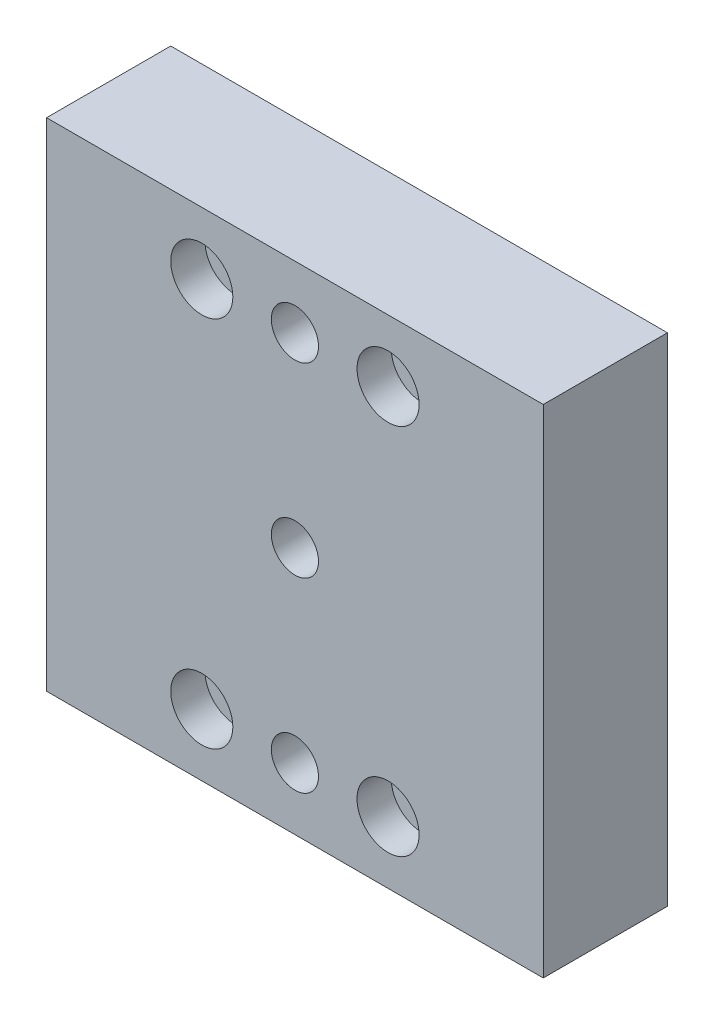
ISO-10303-21;
HEADER;
FILE_DESCRIPTION(('STEP AP214'),'2;1');
FILE_NAME('part.step','',(''),(''),'','','');
FILE_SCHEMA(('AUTOMOTIVE_DESIGN { 1 0 10303 214 1 1 1 1 }'));
ENDSEC;
DATA;
#1=APPLICATION_CONTEXT('core data for automotive mechanical design processes');
#2=APPLICATION_PROTOCOL_DEFINITION('international standard','automotive_design',2000,#1);
#3=PRODUCT_CONTEXT('',#1,'mechanical');
#4=PRODUCT('Part','Part','',(#3));
#5=PRODUCT_RELATED_PRODUCT_CATEGORY('part','',(#4));
#6=PRODUCT_DEFINITION_FORMATION('','',#4);
#7=PRODUCT_DEFINITION_CONTEXT('part definition',#1,'design');
#8=PRODUCT_DEFINITION('design','',#6,#7);
#9=PRODUCT_DEFINITION_SHAPE('','',#8);
#10=(LENGTH_UNIT() NAMED_UNIT(*) SI_UNIT(.MILLI.,.METRE.));
#11=(NAMED_UNIT(*) PLANE_ANGLE_UNIT() SI_UNIT($,.RADIAN.));
#12=(NAMED_UNIT(*) SI_UNIT($,.STERADIAN.) SOLID_ANGLE_UNIT());
#13=UNCERTAINTY_MEASURE_WITH_UNIT(LENGTH_MEASURE(1.E-05),#10,'distance_accuracy_value','');
#14=(GEOMETRIC_REPRESENTATION_CONTEXT(3) GLOBAL_UNCERTAINTY_ASSIGNED_CONTEXT((#13)) GLOBAL_UNIT_ASSIGNED_CONTEXT((#10,
#11,#12)) REPRESENTATION_CONTEXT('',''));
#15=CARTESIAN_POINT('',(0.,0.,0.));
#16=DIRECTION('',(0.,0.,1.));
#17=DIRECTION('',(1.,0.,0.));
#18=AXIS2_PLACEMENT_3D('',#15,#16,#17);
#19=CARTESIAN_POINT('',(25.4,-25.4,12.7));
#20=DIRECTION('',(-1.,0.,0.));
#21=DIRECTION('',(0.,0.,1.));
#22=AXIS2_PLACEMENT_3D('',#19,#20,#21);
#23=PLANE('',#22);
#24=DIRECTION('',(0.,1.,0.));
#25=VECTOR('',#24,1.);
#26=CARTESIAN_POINT('',(25.4,-25.4,0.));
#27=LINE('',#26,#25);
#28=CARTESIAN_POINT('',(25.4,-25.4,0.));
#29=VERTEX_POINT('',#28);
#30=CARTESIAN_POINT('',(25.4,25.4,0.));
#31=VERTEX_POINT('',#30);
#32=EDGE_CURVE('E111',#29,#31,#27,.T.);
#33=ORIENTED_EDGE('',*,*,#32,.T.);
#34=DIRECTION('',(0.,0.,-1.));
#35=VECTOR('',#34,1.);
#36=CARTESIAN_POINT('',(25.4,25.4,12.7));
#37=LINE('',#36,#35);
#38=CARTESIAN_POINT('',(25.4,25.4,12.7));
#39=VERTEX_POINT('',#38);
#40=EDGE_CURVE('E13',#39,#31,#37,.T.);
#41=ORIENTED_EDGE('',*,*,#40,.F.);
#42=DIRECTION('',(0.,1.,0.));
#43=VECTOR('',#42,1.);
#44=CARTESIAN_POINT('',(25.4,-25.4,12.7));
#45=LINE('',#44,#43);
#46=CARTESIAN_POINT('',(25.4,-25.4,12.7));
#47=VERTEX_POINT('',#46);
#48=EDGE_CURVE('E98',#47,#39,#45,.T.);
#49=ORIENTED_EDGE('',*,*,#48,.F.);
#50=DIRECTION('',(0.,0.,-1.));
#51=VECTOR('',#50,1.);
#52=CARTESIAN_POINT('',(25.4,-25.4,12.7));
#53=LINE('',#52,#51);
#54=EDGE_CURVE('E107',#47,#29,#53,.T.);
#55=ORIENTED_EDGE('',*,*,#54,.T.);
#56=EDGE_LOOP('',(#33,#41,#49,#55));
#57=FACE_BOUND('',#56,.T.);
#58=ADVANCED_FACE('F45',(#57),#23,.F.);
#59=CARTESIAN_POINT('',(-25.4,25.4,12.7));
#60=DIRECTION('',(0.,-1.,0.));
#61=DIRECTION('',(0.,0.,-1.));
#62=AXIS2_PLACEMENT_3D('',#59,#60,#61);
#63=PLANE('',#62);
#64=DIRECTION('',(-1.,0.,0.));
#65=VECTOR('',#64,1.);
#66=CARTESIAN_POINT('',(-25.4,25.4,0.));
#67=LINE('',#66,#65);
#68=CARTESIAN_POINT('',(-25.4,25.4,0.));
#69=VERTEX_POINT('',#68);
#70=EDGE_CURVE('E102',#31,#69,#67,.T.);
#71=ORIENTED_EDGE('',*,*,#70,.T.);
#72=DIRECTION('',(0.,0.,-1.));
#73=VECTOR('',#72,1.);
#74=CARTESIAN_POINT('',(-25.4,25.4,12.7));
#75=LINE('',#74,#73);
#76=CARTESIAN_POINT('',(-25.4,25.4,12.7));
#77=VERTEX_POINT('',#76);
#78=EDGE_CURVE('E54',#77,#69,#75,.T.);
#79=ORIENTED_EDGE('',*,*,#78,.F.);
#80=DIRECTION('',(-1.,0.,0.));
#81=VECTOR('',#80,1.);
#82=CARTESIAN_POINT('',(-25.4,25.4,12.7));
#83=LINE('',#82,#81);
#84=EDGE_CURVE('E93',#39,#77,#83,.T.);
#85=ORIENTED_EDGE('',*,*,#84,.F.);
#86=ORIENTED_EDGE('',*,*,#40,.T.);
#87=EDGE_LOOP('',(#71,#79,#85,#86));
#88=FACE_BOUND('',#87,.T.);
#89=ADVANCED_FACE('F101',(#88),#63,.F.);
#90=CARTESIAN_POINT('',(-25.4,-25.4,12.7));
#91=DIRECTION('',(1.,0.,0.));
#92=DIRECTION('',(0.,0.,-1.));
#93=AXIS2_PLACEMENT_3D('',#90,#91,#92);
#94=PLANE('',#93);
#95=DIRECTION('',(0.,-1.,0.));
#96=VECTOR('',#95,1.);
#97=CARTESIAN_POINT('',(-25.4,-25.4,0.));
#98=LINE('',#97,#96);
#99=CARTESIAN_POINT('',(-25.4,-25.4,0.));
#100=VERTEX_POINT('',#99);
#101=EDGE_CURVE('E80',#69,#100,#98,.T.);
#102=ORIENTED_EDGE('',*,*,#101,.T.);
#103=DIRECTION('',(0.,0.,-1.));
#104=VECTOR('',#103,1.);
#105=CARTESIAN_POINT('',(-25.4,-25.4,12.7));
#106=LINE('',#105,#104);
#107=CARTESIAN_POINT('',(-25.4,-25.4,12.7));
#108=VERTEX_POINT('',#107);
#109=EDGE_CURVE('E103',#108,#100,#106,.T.);
#110=ORIENTED_EDGE('',*,*,#109,.F.);
#111=DIRECTION('',(0.,-1.,0.));
#112=VECTOR('',#111,1.);
#113=CARTESIAN_POINT('',(-25.4,-25.4,12.7));
#114=LINE('',#113,#112);
#115=EDGE_CURVE('E96',#77,#108,#114,.T.);
#116=ORIENTED_EDGE('',*,*,#115,.F.);
#117=ORIENTED_EDGE('',*,*,#78,.T.);
#118=EDGE_LOOP('',(#102,#110,#116,#117));
#119=FACE_BOUND('',#118,.T.);
#120=ADVANCED_FACE('F105',(#119),#94,.F.);
#121=CARTESIAN_POINT('',(-25.4,-25.4,12.7));
#122=DIRECTION('',(0.,1.,0.));
#123=DIRECTION('',(0.,0.,1.));
#124=AXIS2_PLACEMENT_3D('',#121,#122,#123);
#125=PLANE('',#124);
#126=DIRECTION('',(1.,0.,0.));
#127=VECTOR('',#126,1.);
#128=CARTESIAN_POINT('',(-25.4,-25.4,0.));
#129=LINE('',#128,#127);
#130=EDGE_CURVE('E86',#100,#29,#129,.T.);
#131=ORIENTED_EDGE('',*,*,#130,.T.);
#132=ORIENTED_EDGE('',*,*,#54,.F.);
#133=DIRECTION('',(1.,0.,0.));
#134=VECTOR('',#133,1.);
#135=CARTESIAN_POINT('',(-25.4,-25.4,12.7));
#136=LINE('',#135,#134);
#137=EDGE_CURVE('E63',#108,#47,#136,.T.);
#138=ORIENTED_EDGE('',*,*,#137,.F.);
#139=ORIENTED_EDGE('',*,*,#109,.T.);
#140=EDGE_LOOP('',(#131,#132,#138,#139));
#141=FACE_BOUND('',#140,.T.);
#142=ADVANCED_FACE('F221',(#141),#125,.F.);
#143=CARTESIAN_POINT('',(0.,0.,12.7));
#144=DIRECTION('',(0.,0.,-1.));
#145=DIRECTION('',(-1.,0.,0.));
#146=AXIS2_PLACEMENT_3D('',#143,#144,#145);
#147=PLANE('',#146);
#148=CARTESIAN_POINT('',(-9.525,19.05,12.7));
#149=DIRECTION('',(0.,0.,1.));
#150=DIRECTION('',(1.,0.,0.));
#151=AXIS2_PLACEMENT_3D('',#148,#149,#150);
#152=CIRCLE('',#151,3.175);
#153=CARTESIAN_POINT('',(-6.35,19.05,12.7));
#154=VERTEX_POINT('',#153);
#155=EDGE_CURVE('E463',#154,#154,#152,.T.);
#156=ORIENTED_EDGE('',*,*,#155,.F.);
#157=EDGE_LOOP('',(#156));
#158=FACE_BOUND('',#157,.T.);
#159=CARTESIAN_POINT('',(-9.525,-19.05,12.7));
#160=DIRECTION('',(0.,0.,1.));
#161=DIRECTION('',(1.,0.,0.));
#162=AXIS2_PLACEMENT_3D('',#159,#160,#161);
#163=CIRCLE('',#162,3.175);
#164=CARTESIAN_POINT('',(-6.35,-19.05,12.7));
#165=VERTEX_POINT('',#164);
#166=EDGE_CURVE('E144',#165,#165,#163,.T.);
#167=ORIENTED_EDGE('',*,*,#166,.F.);
#168=EDGE_LOOP('',(#167));
#169=FACE_BOUND('',#168,.T.);
#170=CARTESIAN_POINT('',(9.52500000000001,-19.05,12.7));
#171=DIRECTION('',(0.,0.,1.));
#172=DIRECTION('',(1.,0.,0.));
#173=AXIS2_PLACEMENT_3D('',#170,#171,#172);
#174=CIRCLE('',#173,3.175);
#175=CARTESIAN_POINT('',(12.7,-19.05,12.7));
#176=VERTEX_POINT('',#175);
#177=EDGE_CURVE('E131',#176,#176,#174,.T.);
#178=ORIENTED_EDGE('',*,*,#177,.F.);
#179=EDGE_LOOP('',(#178));
#180=FACE_BOUND('',#179,.T.);
#181=CARTESIAN_POINT('',(9.525,19.05,12.7));
#182=DIRECTION('',(0.,0.,1.));
#183=DIRECTION('',(1.,0.,0.));
#184=AXIS2_PLACEMENT_3D('',#181,#182,#183);
#185=CIRCLE('',#184,3.175);
#186=CARTESIAN_POINT('',(12.7,19.05,12.7));
#187=VERTEX_POINT('',#186);
#188=EDGE_CURVE('E127',#187,#187,#185,.T.);
#189=ORIENTED_EDGE('',*,*,#188,.F.);
#190=EDGE_LOOP('',(#189));
#191=FACE_BOUND('',#190,.T.);
#192=CARTESIAN_POINT('',(0.,19.05,12.7));
#193=DIRECTION('',(0.,0.,-1.));
#194=DIRECTION('',(-1.,0.,0.));
#195=AXIS2_PLACEMENT_3D('',#192,#193,#194);
#196=CIRCLE('',#195,2.413);
#197=CARTESIAN_POINT('',(-2.413,19.05,12.7));
#198=VERTEX_POINT('',#197);
#199=EDGE_CURVE('E167',#198,#198,#196,.T.);
#200=ORIENTED_EDGE('',*,*,#199,.T.);
#201=EDGE_LOOP('',(#200));
#202=FACE_BOUND('',#201,.T.);
#203=CARTESIAN_POINT('',(0.,0.,12.7));
#204=DIRECTION('',(0.,0.,-1.));
#205=DIRECTION('',(-1.,0.,0.));
#206=AXIS2_PLACEMENT_3D('',#203,#204,#205);
#207=CIRCLE('',#206,2.41299999999999);
#208=CARTESIAN_POINT('',(-2.41299999999999,0.,12.7));
#209=VERTEX_POINT('',#208);
#210=EDGE_CURVE('E179',#209,#209,#207,.T.);
#211=ORIENTED_EDGE('',*,*,#210,.T.);
#212=EDGE_LOOP('',(#211));
#213=FACE_BOUND('',#212,.T.);
#214=CARTESIAN_POINT('',(0.,-19.05,12.7));
#215=DIRECTION('',(0.,0.,-1.));
#216=DIRECTION('',(-1.,0.,0.));
#217=AXIS2_PLACEMENT_3D('',#214,#215,#216);
#218=CIRCLE('',#217,2.413);
#219=CARTESIAN_POINT('',(-2.41299999999999,-19.05,12.7));
#220=VERTEX_POINT('',#219);
#221=EDGE_CURVE('E114',#220,#220,#218,.T.);
#222=ORIENTED_EDGE('',*,*,#221,.T.);
#223=EDGE_LOOP('',(#222));
#224=FACE_BOUND('',#223,.T.);
#225=ORIENTED_EDGE('',*,*,#48,.T.);
#226=ORIENTED_EDGE('',*,*,#84,.T.);
#227=ORIENTED_EDGE('',*,*,#115,.T.);
#228=ORIENTED_EDGE('',*,*,#137,.T.);
#229=EDGE_LOOP('',(#225,#226,#227,#228));
#230=FACE_BOUND('',#229,.T.);
#231=ADVANCED_FACE('F94',(#158,#169,#180,#191,#202,#213,#224,#230),#147,.F.);
#232=CARTESIAN_POINT('',(0.,0.,0.));
#233=DIRECTION('',(0.,0.,-1.));
#234=DIRECTION('',(-1.,0.,0.));
#235=AXIS2_PLACEMENT_3D('',#232,#233,#234);
#236=PLANE('',#235);
#237=CARTESIAN_POINT('',(-9.525,19.05,0.));
#238=DIRECTION('',(0.,0.,-1.));
#239=DIRECTION('',(-1.,0.,0.));
#240=AXIS2_PLACEMENT_3D('',#237,#238,#239);
#241=CIRCLE('',#240,1.75259999999999);
#242=CARTESIAN_POINT('',(-11.2776,19.05,0.));
#243=VERTEX_POINT('',#242);
#244=EDGE_CURVE('E48',#243,#243,#241,.T.);
#245=ORIENTED_EDGE('',*,*,#244,.F.);
#246=EDGE_LOOP('',(#245));
#247=FACE_BOUND('',#246,.T.);
#248=CARTESIAN_POINT('',(-9.525,-19.05,0.));
#249=DIRECTION('',(0.,0.,-1.));
#250=DIRECTION('',(-1.,0.,0.));
#251=AXIS2_PLACEMENT_3D('',#248,#249,#250);
#252=CIRCLE('',#251,1.75259999999999);
#253=CARTESIAN_POINT('',(-11.2776,-19.05,0.));
#254=VERTEX_POINT('',#253);
#255=EDGE_CURVE('E129',#254,#254,#252,.T.);
#256=ORIENTED_EDGE('',*,*,#255,.F.);
#257=EDGE_LOOP('',(#256));
#258=FACE_BOUND('',#257,.T.);
#259=CARTESIAN_POINT('',(9.52500000000001,-19.05,0.));
#260=DIRECTION('',(0.,0.,-1.));
#261=DIRECTION('',(-1.,0.,0.));
#262=AXIS2_PLACEMENT_3D('',#259,#260,#261);
#263=CIRCLE('',#262,1.75259999999999);
#264=CARTESIAN_POINT('',(7.77240000000002,-19.05,0.));
#265=VERTEX_POINT('',#264);
#266=EDGE_CURVE('E125',#265,#265,#263,.T.);
#267=ORIENTED_EDGE('',*,*,#266,.F.);
#268=EDGE_LOOP('',(#267));
#269=FACE_BOUND('',#268,.T.);
#270=CARTESIAN_POINT('',(9.525,19.05,0.));
#271=DIRECTION('',(0.,0.,-1.));
#272=DIRECTION('',(-1.,0.,0.));
#273=AXIS2_PLACEMENT_3D('',#270,#271,#272);
#274=CIRCLE('',#273,1.75259999999999);
#275=CARTESIAN_POINT('',(7.77240000000001,19.05,0.));
#276=VERTEX_POINT('',#275);
#277=EDGE_CURVE('E120',#276,#276,#274,.T.);
#278=ORIENTED_EDGE('',*,*,#277,.F.);
#279=EDGE_LOOP('',(#278));
#280=FACE_BOUND('',#279,.T.);
#281=CARTESIAN_POINT('',(0.,19.05,0.));
#282=DIRECTION('',(0.,0.,-1.));
#283=DIRECTION('',(-1.,0.,0.));
#284=AXIS2_PLACEMENT_3D('',#281,#282,#283);
#285=CIRCLE('',#284,3.17499999999999);
#286=CARTESIAN_POINT('',(-3.17499999999999,19.05,0.));
#287=VERTEX_POINT('',#286);
#288=EDGE_CURVE('E123',#287,#287,#285,.T.);
#289=ORIENTED_EDGE('',*,*,#288,.F.);
#290=EDGE_LOOP('',(#289));
#291=FACE_BOUND('',#290,.T.);
#292=CARTESIAN_POINT('',(0.,0.,0.));
#293=DIRECTION('',(0.,0.,-1.));
#294=DIRECTION('',(-1.,0.,0.));
#295=AXIS2_PLACEMENT_3D('',#292,#293,#294);
#296=CIRCLE('',#295,3.17499999999999);
#297=CARTESIAN_POINT('',(-3.17499999999999,0.,0.));
#298=VERTEX_POINT('',#297);
#299=EDGE_CURVE('E170',#298,#298,#296,.T.);
#300=ORIENTED_EDGE('',*,*,#299,.F.);
#301=EDGE_LOOP('',(#300));
#302=FACE_BOUND('',#301,.T.);
#303=CARTESIAN_POINT('',(0.,-19.05,0.));
#304=DIRECTION('',(0.,0.,-1.));
#305=DIRECTION('',(-1.,0.,0.));
#306=AXIS2_PLACEMENT_3D('',#303,#304,#305);
#307=CIRCLE('',#306,3.17499999999999);
#308=CARTESIAN_POINT('',(-3.17499999999999,-19.05,0.));
#309=VERTEX_POINT('',#308);
#310=EDGE_CURVE('E182',#309,#309,#307,.T.);
#311=ORIENTED_EDGE('',*,*,#310,.F.);
#312=EDGE_LOOP('',(#311));
#313=FACE_BOUND('',#312,.T.);
#314=ORIENTED_EDGE('',*,*,#32,.F.);
#315=ORIENTED_EDGE('',*,*,#130,.F.);
#316=ORIENTED_EDGE('',*,*,#101,.F.);
#317=ORIENTED_EDGE('',*,*,#70,.F.);
#318=EDGE_LOOP('',(#314,#315,#316,#317));
#319=FACE_BOUND('',#318,.T.);
#320=ADVANCED_FACE('F199',(#247,#258,#269,#280,#291,#302,#313,#319),#236,.T.);
#321=CARTESIAN_POINT('',(0.,-19.05,0.));
#322=DIRECTION('',(0.,0.,-1.));
#323=DIRECTION('',(-1.,0.,0.));
#324=AXIS2_PLACEMENT_3D('',#321,#322,#323);
#325=CYLINDRICAL_SURFACE('',#324,2.413);
#326=ORIENTED_EDGE('',*,*,#221,.F.);
#327=EDGE_LOOP('',(#326));
#328=FACE_BOUND('',#327,.T.);
#329=CARTESIAN_POINT('',(0.,-19.05,4.826));
#330=DIRECTION('',(0.,0.,-1.));
#331=DIRECTION('',(-1.,0.,0.));
#332=AXIS2_PLACEMENT_3D('',#329,#330,#331);
#333=CIRCLE('',#332,2.413);
#334=CARTESIAN_POINT('',(-2.41299999999999,-19.05,4.826));
#335=VERTEX_POINT('',#334);
#336=EDGE_CURVE('E188',#335,#335,#333,.T.);
#337=ORIENTED_EDGE('',*,*,#336,.T.);
#338=EDGE_LOOP('',(#337));
#339=FACE_BOUND('',#338,.T.);
#340=ADVANCED_FACE('F195',(#328,#339),#325,.F.);
#341=CARTESIAN_POINT('',(2.41300000000001,-19.05,4.826));
#342=DIRECTION('',(0.,0.,1.));
#343=DIRECTION('',(1.,0.,0.));
#344=AXIS2_PLACEMENT_3D('',#341,#342,#343);
#345=PLANE('',#344);
#346=ORIENTED_EDGE('',*,*,#336,.F.);
#347=EDGE_LOOP('',(#346));
#348=FACE_BOUND('',#347,.T.);
#349=CARTESIAN_POINT('',(0.,-19.05,4.826));
#350=DIRECTION('',(0.,0.,-1.));
#351=DIRECTION('',(-1.,0.,0.));
#352=AXIS2_PLACEMENT_3D('',#349,#350,#351);
#353=CIRCLE('',#352,3.175);
#354=CARTESIAN_POINT('',(-3.17499999999999,-19.05,4.826));
#355=VERTEX_POINT('',#354);
#356=EDGE_CURVE('E185',#355,#355,#353,.T.);
#357=ORIENTED_EDGE('',*,*,#356,.T.);
#358=EDGE_LOOP('',(#357));
#359=FACE_BOUND('',#358,.T.);
#360=ADVANCED_FACE('F198',(#348,#359),#345,.F.);
#361=CARTESIAN_POINT('',(0.,-19.05,0.));
#362=DIRECTION('',(0.,0.,-1.));
#363=DIRECTION('',(-1.,0.,0.));
#364=AXIS2_PLACEMENT_3D('',#361,#362,#363);
#365=CYLINDRICAL_SURFACE('',#364,3.175);
#366=ORIENTED_EDGE('',*,*,#356,.F.);
#367=EDGE_LOOP('',(#366));
#368=FACE_BOUND('',#367,.T.);
#369=ORIENTED_EDGE('',*,*,#310,.T.);
#370=EDGE_LOOP('',(#369));
#371=FACE_BOUND('',#370,.T.);
#372=ADVANCED_FACE('F205',(#368,#371),#365,.F.);
#373=CARTESIAN_POINT('',(0.,0.,0.));
#374=DIRECTION('',(0.,0.,-1.));
#375=DIRECTION('',(-1.,0.,0.));
#376=AXIS2_PLACEMENT_3D('',#373,#374,#375);
#377=CYLINDRICAL_SURFACE('',#376,2.41299999999999);
#378=ORIENTED_EDGE('',*,*,#210,.F.);
#379=EDGE_LOOP('',(#378));
#380=FACE_BOUND('',#379,.T.);
#381=CARTESIAN_POINT('',(0.,0.,4.826));
#382=DIRECTION('',(0.,0.,-1.));
#383=DIRECTION('',(-1.,0.,0.));
#384=AXIS2_PLACEMENT_3D('',#381,#382,#383);
#385=CIRCLE('',#384,2.413);
#386=CARTESIAN_POINT('',(-2.41299999999999,0.,4.826));
#387=VERTEX_POINT('',#386);
#388=EDGE_CURVE('E176',#387,#387,#385,.T.);
#389=ORIENTED_EDGE('',*,*,#388,.T.);
#390=EDGE_LOOP('',(#389));
#391=FACE_BOUND('',#390,.T.);
#392=ADVANCED_FACE('F211',(#380,#391),#377,.F.);
#393=CARTESIAN_POINT('',(2.413,0.,4.826));
#394=DIRECTION('',(0.,0.,1.));
#395=DIRECTION('',(1.,0.,0.));
#396=AXIS2_PLACEMENT_3D('',#393,#394,#395);
#397=PLANE('',#396);
#398=ORIENTED_EDGE('',*,*,#388,.F.);
#399=EDGE_LOOP('',(#398));
#400=FACE_BOUND('',#399,.T.);
#401=CARTESIAN_POINT('',(0.,0.,4.826));
#402=DIRECTION('',(0.,0.,-1.));
#403=DIRECTION('',(-1.,0.,0.));
#404=AXIS2_PLACEMENT_3D('',#401,#402,#403);
#405=CIRCLE('',#404,3.175);
#406=CARTESIAN_POINT('',(-3.17499999999999,0.,4.826));
#407=VERTEX_POINT('',#406);
#408=EDGE_CURVE('E173',#407,#407,#405,.T.);
#409=ORIENTED_EDGE('',*,*,#408,.T.);
#410=EDGE_LOOP('',(#409));
#411=FACE_BOUND('',#410,.T.);
#412=ADVANCED_FACE('F274',(#400,#411),#397,.F.);
#413=CARTESIAN_POINT('',(0.,0.,0.));
#414=DIRECTION('',(0.,0.,-1.));
#415=DIRECTION('',(-1.,0.,0.));
#416=AXIS2_PLACEMENT_3D('',#413,#414,#415);
#417=CYLINDRICAL_SURFACE('',#416,3.17499999999999);
#418=ORIENTED_EDGE('',*,*,#408,.F.);
#419=EDGE_LOOP('',(#418));
#420=FACE_BOUND('',#419,.T.);
#421=ORIENTED_EDGE('',*,*,#299,.T.);
#422=EDGE_LOOP('',(#421));
#423=FACE_BOUND('',#422,.T.);
#424=ADVANCED_FACE('F284',(#420,#423),#417,.F.);
#425=CARTESIAN_POINT('',(0.,19.05,0.));
#426=DIRECTION('',(0.,0.,-1.));
#427=DIRECTION('',(-1.,0.,0.));
#428=AXIS2_PLACEMENT_3D('',#425,#426,#427);
#429=CYLINDRICAL_SURFACE('',#428,2.413);
#430=ORIENTED_EDGE('',*,*,#199,.F.);
#431=EDGE_LOOP('',(#430));
#432=FACE_BOUND('',#431,.T.);
#433=CARTESIAN_POINT('',(0.,19.05,4.826));
#434=DIRECTION('',(0.,0.,-1.));
#435=DIRECTION('',(-1.,0.,0.));
#436=AXIS2_PLACEMENT_3D('',#433,#434,#435);
#437=CIRCLE('',#436,2.413);
#438=CARTESIAN_POINT('',(-2.413,19.05,4.826));
#439=VERTEX_POINT('',#438);
#440=EDGE_CURVE('E164',#439,#439,#437,.T.);
#441=ORIENTED_EDGE('',*,*,#440,.T.);
#442=EDGE_LOOP('',(#441));
#443=FACE_BOUND('',#442,.T.);
#444=ADVANCED_FACE('F294',(#432,#443),#429,.F.);
#445=CARTESIAN_POINT('',(2.413,19.05,4.826));
#446=DIRECTION('',(0.,0.,1.));
#447=DIRECTION('',(1.,0.,0.));
#448=AXIS2_PLACEMENT_3D('',#445,#446,#447);
#449=PLANE('',#448);
#450=ORIENTED_EDGE('',*,*,#440,.F.);
#451=EDGE_LOOP('',(#450));
#452=FACE_BOUND('',#451,.T.);
#453=CARTESIAN_POINT('',(0.,19.05,4.826));
#454=DIRECTION('',(0.,0.,-1.));
#455=DIRECTION('',(-1.,0.,0.));
#456=AXIS2_PLACEMENT_3D('',#453,#454,#455);
#457=CIRCLE('',#456,3.175);
#458=CARTESIAN_POINT('',(-3.175,19.05,4.826));
#459=VERTEX_POINT('',#458);
#460=EDGE_CURVE('E161',#459,#459,#457,.T.);
#461=ORIENTED_EDGE('',*,*,#460,.T.);
#462=EDGE_LOOP('',(#461));
#463=FACE_BOUND('',#462,.T.);
#464=ADVANCED_FACE('F304',(#452,#463),#449,.F.);
#465=CARTESIAN_POINT('',(0.,19.05,0.));
#466=DIRECTION('',(0.,0.,-1.));
#467=DIRECTION('',(-1.,0.,0.));
#468=AXIS2_PLACEMENT_3D('',#465,#466,#467);
#469=CYLINDRICAL_SURFACE('',#468,3.175);
#470=ORIENTED_EDGE('',*,*,#460,.F.);
#471=EDGE_LOOP('',(#470));
#472=FACE_BOUND('',#471,.T.);
#473=ORIENTED_EDGE('',*,*,#288,.T.);
#474=EDGE_LOOP('',(#473));
#475=FACE_BOUND('',#474,.T.);
#476=ADVANCED_FACE('F314',(#472,#475),#469,.F.);
#477=CARTESIAN_POINT('',(9.525,19.05,12.7));
#478=DIRECTION('',(0.,0.,1.));
#479=DIRECTION('',(1.,0.,0.));
#480=AXIS2_PLACEMENT_3D('',#477,#478,#479);
#481=CYLINDRICAL_SURFACE('',#480,1.75259999999999);
#482=ORIENTED_EDGE('',*,*,#277,.T.);
#483=EDGE_LOOP('',(#482));
#484=FACE_BOUND('',#483,.T.);
#485=CARTESIAN_POINT('',(9.525,19.05,9.1948));
#486=DIRECTION('',(0.,0.,1.));
#487=DIRECTION('',(1.,0.,0.));
#488=AXIS2_PLACEMENT_3D('',#485,#486,#487);
#489=CIRCLE('',#488,1.75259999999999);
#490=CARTESIAN_POINT('',(11.2776,19.05,9.1948));
#491=VERTEX_POINT('',#490);
#492=EDGE_CURVE('E124',#491,#491,#489,.T.);
#493=ORIENTED_EDGE('',*,*,#492,.T.);
#494=EDGE_LOOP('',(#493));
#495=FACE_BOUND('',#494,.T.);
#496=ADVANCED_FACE('F324',(#484,#495),#481,.F.);
#497=CARTESIAN_POINT('',(11.2776,19.05,9.1948));
#498=DIRECTION('',(0.,0.,-1.));
#499=DIRECTION('',(-1.,0.,0.));
#500=AXIS2_PLACEMENT_3D('',#497,#498,#499);
#501=PLANE('',#500);
#502=ORIENTED_EDGE('',*,*,#492,.F.);
#503=EDGE_LOOP('',(#502));
#504=FACE_BOUND('',#503,.T.);
#505=CARTESIAN_POINT('',(9.525,19.05,9.1948));
#506=DIRECTION('',(0.,0.,1.));
#507=DIRECTION('',(1.,0.,0.));
#508=AXIS2_PLACEMENT_3D('',#505,#506,#507);
#509=CIRCLE('',#508,3.175);
#510=CARTESIAN_POINT('',(12.7,19.05,9.1948));
#511=VERTEX_POINT('',#510);
#512=EDGE_CURVE('E154',#511,#511,#509,.T.);
#513=ORIENTED_EDGE('',*,*,#512,.T.);
#514=EDGE_LOOP('',(#513));
#515=FACE_BOUND('',#514,.T.);
#516=ADVANCED_FACE('F344',(#504,#515),#501,.F.);
#517=CARTESIAN_POINT('',(9.525,19.05,12.7));
#518=DIRECTION('',(0.,0.,1.));
#519=DIRECTION('',(1.,0.,0.));
#520=AXIS2_PLACEMENT_3D('',#517,#518,#519);
#521=CYLINDRICAL_SURFACE('',#520,3.175);
#522=ORIENTED_EDGE('',*,*,#512,.F.);
#523=EDGE_LOOP('',(#522));
#524=FACE_BOUND('',#523,.T.);
#525=ORIENTED_EDGE('',*,*,#188,.T.);
#526=EDGE_LOOP('',(#525));
#527=FACE_BOUND('',#526,.T.);
#528=ADVANCED_FACE('F354',(#524,#527),#521,.F.);
#529=CARTESIAN_POINT('',(9.52500000000001,-19.05,12.7));
#530=DIRECTION('',(0.,0.,1.));
#531=DIRECTION('',(1.,0.,0.));
#532=AXIS2_PLACEMENT_3D('',#529,#530,#531);
#533=CYLINDRICAL_SURFACE('',#532,1.75259999999999);
#534=ORIENTED_EDGE('',*,*,#266,.T.);
#535=EDGE_LOOP('',(#534));
#536=FACE_BOUND('',#535,.T.);
#537=CARTESIAN_POINT('',(9.52500000000001,-19.05,9.1948));
#538=DIRECTION('',(0.,0.,1.));
#539=DIRECTION('',(1.,0.,0.));
#540=AXIS2_PLACEMENT_3D('',#537,#538,#539);
#541=CIRCLE('',#540,1.75259999999999);
#542=CARTESIAN_POINT('',(11.2776,-19.05,9.1948));
#543=VERTEX_POINT('',#542);
#544=EDGE_CURVE('E128',#543,#543,#541,.T.);
#545=ORIENTED_EDGE('',*,*,#544,.T.);
#546=EDGE_LOOP('',(#545));
#547=FACE_BOUND('',#546,.T.);
#548=ADVANCED_FACE('F364',(#536,#547),#533,.F.);
#549=CARTESIAN_POINT('',(11.2776,-19.05,9.1948));
#550=DIRECTION('',(0.,0.,-1.));
#551=DIRECTION('',(-1.,0.,0.));
#552=AXIS2_PLACEMENT_3D('',#549,#550,#551);
#553=PLANE('',#552);
#554=ORIENTED_EDGE('',*,*,#544,.F.);
#555=EDGE_LOOP('',(#554));
#556=FACE_BOUND('',#555,.T.);
#557=CARTESIAN_POINT('',(9.52500000000001,-19.05,9.1948));
#558=DIRECTION('',(0.,0.,1.));
#559=DIRECTION('',(1.,0.,0.));
#560=AXIS2_PLACEMENT_3D('',#557,#558,#559);
#561=CIRCLE('',#560,3.175);
#562=CARTESIAN_POINT('',(12.7,-19.05,9.1948));
#563=VERTEX_POINT('',#562);
#564=EDGE_CURVE('E136',#563,#563,#561,.T.);
#565=ORIENTED_EDGE('',*,*,#564,.T.);
#566=EDGE_LOOP('',(#565));
#567=FACE_BOUND('',#566,.T.);
#568=ADVANCED_FACE('F374',(#556,#567),#553,.F.);
#569=CARTESIAN_POINT('',(9.52500000000001,-19.05,12.7));
#570=DIRECTION('',(0.,0.,1.));
#571=DIRECTION('',(1.,0.,0.));
#572=AXIS2_PLACEMENT_3D('',#569,#570,#571);
#573=CYLINDRICAL_SURFACE('',#572,3.175);
#574=ORIENTED_EDGE('',*,*,#564,.F.);
#575=EDGE_LOOP('',(#574));
#576=FACE_BOUND('',#575,.T.);
#577=ORIENTED_EDGE('',*,*,#177,.T.);
#578=EDGE_LOOP('',(#577));
#579=FACE_BOUND('',#578,.T.);
#580=ADVANCED_FACE('F384',(#576,#579),#573,.F.);
#581=CARTESIAN_POINT('',(-9.525,-19.05,12.7));
#582=DIRECTION('',(0.,0.,1.));
#583=DIRECTION('',(1.,0.,0.));
#584=AXIS2_PLACEMENT_3D('',#581,#582,#583);
#585=CYLINDRICAL_SURFACE('',#584,1.75259999999999);
#586=ORIENTED_EDGE('',*,*,#255,.T.);
#587=EDGE_LOOP('',(#586));
#588=FACE_BOUND('',#587,.T.);
#589=CARTESIAN_POINT('',(-9.525,-19.05,9.1948));
#590=DIRECTION('',(0.,0.,1.));
#591=DIRECTION('',(1.,0.,0.));
#592=AXIS2_PLACEMENT_3D('',#589,#590,#591);
#593=CIRCLE('',#592,1.75259999999999);
#594=CARTESIAN_POINT('',(-7.77240000000001,-19.05,9.1948));
#595=VERTEX_POINT('',#594);
#596=EDGE_CURVE('E132',#595,#595,#593,.T.);
#597=ORIENTED_EDGE('',*,*,#596,.T.);
#598=EDGE_LOOP('',(#597));
#599=FACE_BOUND('',#598,.T.);
#600=ADVANCED_FACE('F394',(#588,#599),#585,.F.);
#601=CARTESIAN_POINT('',(-7.77240000000001,-19.05,9.1948));
#602=DIRECTION('',(0.,0.,-1.));
#603=DIRECTION('',(-1.,0.,0.));
#604=AXIS2_PLACEMENT_3D('',#601,#602,#603);
#605=PLANE('',#604);
#606=ORIENTED_EDGE('',*,*,#596,.F.);
#607=EDGE_LOOP('',(#606));
#608=FACE_BOUND('',#607,.T.);
#609=CARTESIAN_POINT('',(-9.525,-19.05,9.1948));
#610=DIRECTION('',(0.,0.,1.));
#611=DIRECTION('',(1.,0.,0.));
#612=AXIS2_PLACEMENT_3D('',#609,#610,#611);
#613=CIRCLE('',#612,3.175);
#614=CARTESIAN_POINT('',(-6.35,-19.05,9.1948));
#615=VERTEX_POINT('',#614);
#616=EDGE_CURVE('E139',#615,#615,#613,.T.);
#617=ORIENTED_EDGE('',*,*,#616,.T.);
#618=EDGE_LOOP('',(#617));
#619=FACE_BOUND('',#618,.T.);
#620=ADVANCED_FACE('F404',(#608,#619),#605,.F.);
#621=CARTESIAN_POINT('',(-9.525,-19.05,12.7));
#622=DIRECTION('',(0.,0.,1.));
#623=DIRECTION('',(1.,0.,0.));
#624=AXIS2_PLACEMENT_3D('',#621,#622,#623);
#625=CYLINDRICAL_SURFACE('',#624,3.175);
#626=ORIENTED_EDGE('',*,*,#616,.F.);
#627=EDGE_LOOP('',(#626));
#628=FACE_BOUND('',#627,.T.);
#629=ORIENTED_EDGE('',*,*,#166,.T.);
#630=EDGE_LOOP('',(#629));
#631=FACE_BOUND('',#630,.T.);
#632=ADVANCED_FACE('F413',(#628,#631),#625,.F.);
#633=CARTESIAN_POINT('',(-9.525,19.05,12.7));
#634=DIRECTION('',(0.,0.,1.));
#635=DIRECTION('',(1.,0.,0.));
#636=AXIS2_PLACEMENT_3D('',#633,#634,#635);
#637=CYLINDRICAL_SURFACE('',#636,1.75259999999999);
#638=ORIENTED_EDGE('',*,*,#244,.T.);
#639=EDGE_LOOP('',(#638));
#640=FACE_BOUND('',#639,.T.);
#641=CARTESIAN_POINT('',(-9.525,19.05,9.1948));
#642=DIRECTION('',(0.,0.,1.));
#643=DIRECTION('',(1.,0.,0.));
#644=AXIS2_PLACEMENT_3D('',#641,#642,#643);
#645=CIRCLE('',#644,1.75259999999999);
#646=CARTESIAN_POINT('',(-7.77240000000001,19.05,9.1948));
#647=VERTEX_POINT('',#646);
#648=EDGE_CURVE('E465',#647,#647,#645,.T.);
#649=ORIENTED_EDGE('',*,*,#648,.T.);
#650=EDGE_LOOP('',(#649));
#651=FACE_BOUND('',#650,.T.);
#652=ADVANCED_FACE('F423',(#640,#651),#637,.F.);
#653=CARTESIAN_POINT('',(-7.77240000000001,19.05,9.1948));
#654=DIRECTION('',(0.,0.,-1.));
#655=DIRECTION('',(-1.,0.,0.));
#656=AXIS2_PLACEMENT_3D('',#653,#654,#655);
#657=PLANE('',#656);
#658=ORIENTED_EDGE('',*,*,#648,.F.);
#659=EDGE_LOOP('',(#658));
#660=FACE_BOUND('',#659,.T.);
#661=CARTESIAN_POINT('',(-9.525,19.05,9.1948));
#662=DIRECTION('',(0.,0.,1.));
#663=DIRECTION('',(1.,0.,0.));
#664=AXIS2_PLACEMENT_3D('',#661,#662,#663);
#665=CIRCLE('',#664,3.175);
#666=CARTESIAN_POINT('',(-6.35,19.05,9.1948));
#667=VERTEX_POINT('',#666);
#668=EDGE_CURVE('E460',#667,#667,#665,.T.);
#669=ORIENTED_EDGE('',*,*,#668,.T.);
#670=EDGE_LOOP('',(#669));
#671=FACE_BOUND('',#670,.T.);
#672=ADVANCED_FACE('F433',(#660,#671),#657,.F.);
#673=CARTESIAN_POINT('',(-9.525,19.05,12.7));
#674=DIRECTION('',(0.,0.,1.));
#675=DIRECTION('',(1.,0.,0.));
#676=AXIS2_PLACEMENT_3D('',#673,#674,#675);
#677=CYLINDRICAL_SURFACE('',#676,3.175);
#678=ORIENTED_EDGE('',*,*,#668,.F.);
#679=EDGE_LOOP('',(#678));
#680=FACE_BOUND('',#679,.T.);
#681=ORIENTED_EDGE('',*,*,#155,.T.);
#682=EDGE_LOOP('',(#681));
#683=FACE_BOUND('',#682,.T.);
#684=ADVANCED_FACE('F443',(#680,#683),#677,.F.);
#685=CLOSED_SHELL('',(#58,#89,#120,#142,#231,#320,#340,#360,#372,#392,#412,#424,#444,#464,#476,
#496,#516,#528,#548,#568,#580,#600,#620,#632,#652,#672,#684));
#686=MANIFOLD_SOLID_BREP('B2',#685);
#687=ADVANCED_BREP_SHAPE_REPRESENTATION('',(#18,#686),#14);
#688=SHAPE_DEFINITION_REPRESENTATION(#9,#687);
ENDSEC;
END-ISO-10303-21;
